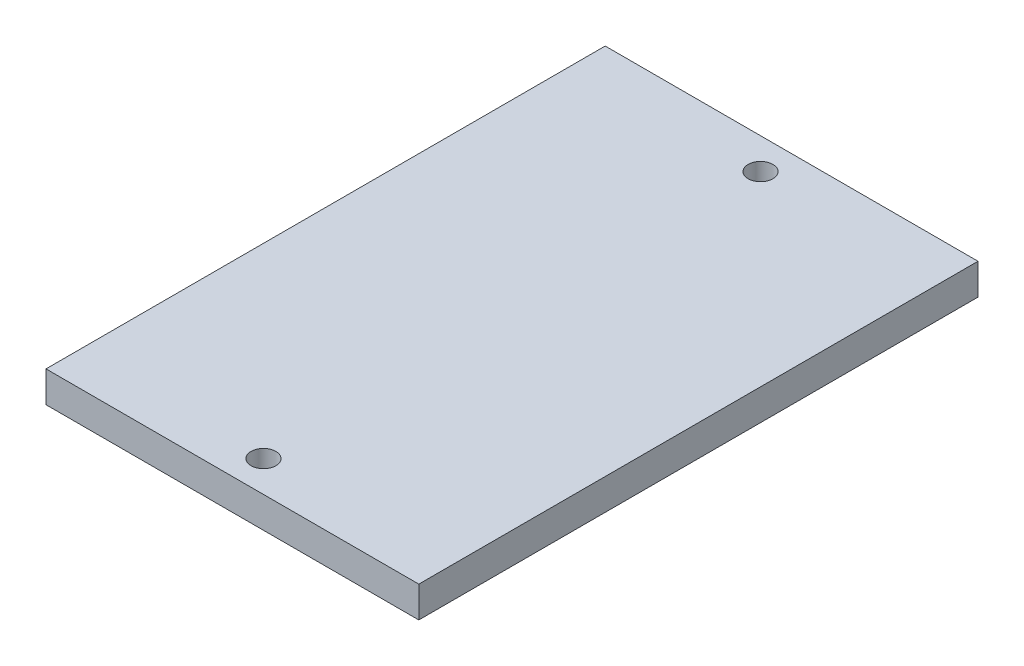
ISO-10303-21;
HEADER;
FILE_DESCRIPTION(('STEP AP214'),'2;1');
FILE_NAME('part.step','',(''),(''),'','','');
FILE_SCHEMA(('AUTOMOTIVE_DESIGN { 1 0 10303 214 1 1 1 1 }'));
ENDSEC;
DATA;
#1=APPLICATION_CONTEXT('core data for automotive mechanical design processes');
#2=APPLICATION_PROTOCOL_DEFINITION('international standard','automotive_design',2000,#1);
#3=PRODUCT_CONTEXT('',#1,'mechanical');
#4=PRODUCT('Part','Part','',(#3));
#5=PRODUCT_RELATED_PRODUCT_CATEGORY('part','',(#4));
#6=PRODUCT_DEFINITION_FORMATION('','',#4);
#7=PRODUCT_DEFINITION_CONTEXT('part definition',#1,'design');
#8=PRODUCT_DEFINITION('design','',#6,#7);
#9=PRODUCT_DEFINITION_SHAPE('','',#8);
#10=(LENGTH_UNIT() NAMED_UNIT(*) SI_UNIT(.MILLI.,.METRE.));
#11=(NAMED_UNIT(*) PLANE_ANGLE_UNIT() SI_UNIT($,.RADIAN.));
#12=(NAMED_UNIT(*) SI_UNIT($,.STERADIAN.) SOLID_ANGLE_UNIT());
#13=UNCERTAINTY_MEASURE_WITH_UNIT(LENGTH_MEASURE(1.E-05),#10,'distance_accuracy_value','');
#14=(GEOMETRIC_REPRESENTATION_CONTEXT(3) GLOBAL_UNCERTAINTY_ASSIGNED_CONTEXT((#13)) GLOBAL_UNIT_ASSIGNED_CONTEXT((#10,
#11,#12)) REPRESENTATION_CONTEXT('',''));
#15=CARTESIAN_POINT('',(0.,0.,0.));
#16=DIRECTION('',(0.,0.,1.));
#17=DIRECTION('',(1.,0.,0.));
#18=AXIS2_PLACEMENT_3D('',#15,#16,#17);
#19=CARTESIAN_POINT('',(36.2285196606894,6.35,57.15));
#20=DIRECTION('',(-1.,0.,0.));
#21=DIRECTION('',(0.,0.,1.));
#22=AXIS2_PLACEMENT_3D('',#19,#20,#21);
#23=PLANE('',#22);
#24=DIRECTION('',(0.,0.,-1.));
#25=VECTOR('',#24,1.);
#26=CARTESIAN_POINT('',(36.2285196606894,0.,57.15));
#27=LINE('',#26,#25);
#28=CARTESIAN_POINT('',(36.2285196606894,0.,57.15));
#29=VERTEX_POINT('',#28);
#30=CARTESIAN_POINT('',(36.2285196606894,0.,-57.15));
#31=VERTEX_POINT('',#30);
#32=EDGE_CURVE('E114',#29,#31,#27,.T.);
#33=ORIENTED_EDGE('',*,*,#32,.T.);
#34=DIRECTION('',(0.,-1.,0.));
#35=VECTOR('',#34,1.);
#36=CARTESIAN_POINT('',(36.2285196606894,6.35,-57.15));
#37=LINE('',#36,#35);
#38=CARTESIAN_POINT('',(36.2285196606894,6.35,-57.15));
#39=VERTEX_POINT('',#38);
#40=EDGE_CURVE('E11',#39,#31,#37,.T.);
#41=ORIENTED_EDGE('',*,*,#40,.F.);
#42=DIRECTION('',(0.,0.,-1.));
#43=VECTOR('',#42,1.);
#44=CARTESIAN_POINT('',(36.2285196606894,6.35,57.15));
#45=LINE('',#44,#43);
#46=CARTESIAN_POINT('',(36.2285196606894,6.35,57.15));
#47=VERTEX_POINT('',#46);
#48=EDGE_CURVE('E97',#47,#39,#45,.T.);
#49=ORIENTED_EDGE('',*,*,#48,.F.);
#50=DIRECTION('',(0.,-1.,0.));
#51=VECTOR('',#50,1.);
#52=CARTESIAN_POINT('',(36.2285196606894,6.35,57.15));
#53=LINE('',#52,#51);
#54=EDGE_CURVE('E110',#47,#29,#53,.T.);
#55=ORIENTED_EDGE('',*,*,#54,.T.);
#56=EDGE_LOOP('',(#33,#41,#49,#55));
#57=FACE_BOUND('',#56,.T.);
#58=ADVANCED_FACE('F43',(#57),#23,.F.);
#59=CARTESIAN_POINT('',(-39.9714803393106,6.35,-57.15));
#60=DIRECTION('',(0.,0.,1.));
#61=DIRECTION('',(1.,0.,0.));
#62=AXIS2_PLACEMENT_3D('',#59,#60,#61);
#63=PLANE('',#62);
#64=DIRECTION('',(-1.,0.,0.));
#65=VECTOR('',#64,1.);
#66=CARTESIAN_POINT('',(-39.9714803393106,0.,-57.15));
#67=LINE('',#66,#65);
#68=CARTESIAN_POINT('',(-39.9714803393106,0.,-57.15));
#69=VERTEX_POINT('',#68);
#70=EDGE_CURVE('E102',#31,#69,#67,.T.);
#71=ORIENTED_EDGE('',*,*,#70,.T.);
#72=DIRECTION('',(0.,-1.,0.));
#73=VECTOR('',#72,1.);
#74=CARTESIAN_POINT('',(-39.9714803393106,6.35,-57.15));
#75=LINE('',#74,#73);
#76=CARTESIAN_POINT('',(-39.9714803393106,6.35,-57.15));
#77=VERTEX_POINT('',#76);
#78=EDGE_CURVE('E53',#77,#69,#75,.T.);
#79=ORIENTED_EDGE('',*,*,#78,.F.);
#80=DIRECTION('',(-1.,0.,0.));
#81=VECTOR('',#80,1.);
#82=CARTESIAN_POINT('',(-39.9714803393106,6.35,-57.15));
#83=LINE('',#82,#81);
#84=EDGE_CURVE('E92',#39,#77,#83,.T.);
#85=ORIENTED_EDGE('',*,*,#84,.F.);
#86=ORIENTED_EDGE('',*,*,#40,.T.);
#87=EDGE_LOOP('',(#71,#79,#85,#86));
#88=FACE_BOUND('',#87,.T.);
#89=ADVANCED_FACE('F101',(#88),#63,.F.);
#90=CARTESIAN_POINT('',(-39.9714803393106,6.35,57.15));
#91=DIRECTION('',(1.,0.,0.));
#92=DIRECTION('',(0.,0.,-1.));
#93=AXIS2_PLACEMENT_3D('',#90,#91,#92);
#94=PLANE('',#93);
#95=DIRECTION('',(0.,0.,1.));
#96=VECTOR('',#95,1.);
#97=CARTESIAN_POINT('',(-39.9714803393106,0.,57.15));
#98=LINE('',#97,#96);
#99=CARTESIAN_POINT('',(-39.9714803393106,0.,57.15));
#100=VERTEX_POINT('',#99);
#101=EDGE_CURVE('E79',#69,#100,#98,.T.);
#102=ORIENTED_EDGE('',*,*,#101,.T.);
#103=DIRECTION('',(0.,-1.,0.));
#104=VECTOR('',#103,1.);
#105=CARTESIAN_POINT('',(-39.9714803393106,6.35,57.15));
#106=LINE('',#105,#104);
#107=CARTESIAN_POINT('',(-39.9714803393106,6.35,57.15));
#108=VERTEX_POINT('',#107);
#109=EDGE_CURVE('E104',#108,#100,#106,.T.);
#110=ORIENTED_EDGE('',*,*,#109,.F.);
#111=DIRECTION('',(0.,0.,1.));
#112=VECTOR('',#111,1.);
#113=CARTESIAN_POINT('',(-39.9714803393106,6.35,57.15));
#114=LINE('',#113,#112);
#115=EDGE_CURVE('E95',#77,#108,#114,.T.);
#116=ORIENTED_EDGE('',*,*,#115,.F.);
#117=ORIENTED_EDGE('',*,*,#78,.T.);
#118=EDGE_LOOP('',(#102,#110,#116,#117));
#119=FACE_BOUND('',#118,.T.);
#120=ADVANCED_FACE('F106',(#119),#94,.F.);
#121=CARTESIAN_POINT('',(-39.9714803393106,6.35,57.15));
#122=DIRECTION('',(0.,0.,-1.));
#123=DIRECTION('',(-1.,0.,0.));
#124=AXIS2_PLACEMENT_3D('',#121,#122,#123);
#125=PLANE('',#124);
#126=DIRECTION('',(1.,0.,0.));
#127=VECTOR('',#126,1.);
#128=CARTESIAN_POINT('',(-39.9714803393106,0.,57.15));
#129=LINE('',#128,#127);
#130=EDGE_CURVE('E85',#100,#29,#129,.T.);
#131=ORIENTED_EDGE('',*,*,#130,.T.);
#132=ORIENTED_EDGE('',*,*,#54,.F.);
#133=DIRECTION('',(1.,0.,0.));
#134=VECTOR('',#133,1.);
#135=CARTESIAN_POINT('',(-39.9714803393106,6.35,57.15));
#136=LINE('',#135,#134);
#137=EDGE_CURVE('E62',#108,#47,#136,.T.);
#138=ORIENTED_EDGE('',*,*,#137,.F.);
#139=ORIENTED_EDGE('',*,*,#109,.T.);
#140=EDGE_LOOP('',(#131,#132,#138,#139));
#141=FACE_BOUND('',#140,.T.);
#142=ADVANCED_FACE('F151',(#141),#125,.F.);
#143=CARTESIAN_POINT('',(0.,6.35,0.));
#144=DIRECTION('',(0.,-1.,0.));
#145=DIRECTION('',(0.,0.,-1.));
#146=AXIS2_PLACEMENT_3D('',#143,#144,#145);
#147=PLANE('',#146);
#148=CARTESIAN_POINT('',(-1.87148033931061,6.35,-50.8));
#149=DIRECTION('',(0.,1.,0.));
#150=DIRECTION('',(0.,0.,1.));
#151=AXIS2_PLACEMENT_3D('',#148,#149,#150);
#152=CIRCLE('',#151,2.53999999999999);
#153=CARTESIAN_POINT('',(-1.87148033931061,6.35,-48.26));
#154=VERTEX_POINT('',#153);
#155=EDGE_CURVE('E130',#154,#154,#152,.T.);
#156=ORIENTED_EDGE('',*,*,#155,.F.);
#157=EDGE_LOOP('',(#156));
#158=FACE_BOUND('',#157,.T.);
#159=CARTESIAN_POINT('',(-1.87148033931064,6.35,50.8));
#160=DIRECTION('',(0.,1.,0.));
#161=DIRECTION('',(0.,0.,-1.));
#162=AXIS2_PLACEMENT_3D('',#159,#160,#161);
#163=CIRCLE('',#162,2.53999999999999);
#164=CARTESIAN_POINT('',(-1.87148033931064,6.35,53.34));
#165=VERTEX_POINT('',#164);
#166=EDGE_CURVE('E137',#165,#165,#163,.T.);
#167=ORIENTED_EDGE('',*,*,#166,.F.);
#168=EDGE_LOOP('',(#167));
#169=FACE_BOUND('',#168,.T.);
#170=ORIENTED_EDGE('',*,*,#48,.T.);
#171=ORIENTED_EDGE('',*,*,#84,.T.);
#172=ORIENTED_EDGE('',*,*,#115,.T.);
#173=ORIENTED_EDGE('',*,*,#137,.T.);
#174=EDGE_LOOP('',(#170,#171,#172,#173));
#175=FACE_BOUND('',#174,.T.);
#176=ADVANCED_FACE('F93',(#158,#169,#175),#147,.F.);
#177=CARTESIAN_POINT('',(0.,0.,0.));
#178=DIRECTION('',(0.,-1.,0.));
#179=DIRECTION('',(0.,0.,-1.));
#180=AXIS2_PLACEMENT_3D('',#177,#178,#179);
#181=PLANE('',#180);
#182=CARTESIAN_POINT('',(-1.87148033931061,0.,-50.8));
#183=DIRECTION('',(0.,-1.,0.));
#184=DIRECTION('',(0.,0.,-1.));
#185=AXIS2_PLACEMENT_3D('',#182,#183,#184);
#186=CIRCLE('',#185,2.53999999999999);
#187=CARTESIAN_POINT('',(-1.87148033931061,0.,-48.26));
#188=VERTEX_POINT('',#187);
#189=EDGE_CURVE('E46',#188,#188,#186,.T.);
#190=ORIENTED_EDGE('',*,*,#189,.F.);
#191=EDGE_LOOP('',(#190));
#192=FACE_BOUND('',#191,.T.);
#193=CARTESIAN_POINT('',(-1.87148033931064,0.,50.8));
#194=DIRECTION('',(0.,-1.,0.));
#195=DIRECTION('',(0.,0.,-1.));
#196=AXIS2_PLACEMENT_3D('',#193,#194,#195);
#197=CIRCLE('',#196,2.53999999999999);
#198=CARTESIAN_POINT('',(-1.87148033931064,0.,53.34));
#199=VERTEX_POINT('',#198);
#200=EDGE_CURVE('E127',#199,#199,#197,.T.);
#201=ORIENTED_EDGE('',*,*,#200,.F.);
#202=EDGE_LOOP('',(#201));
#203=FACE_BOUND('',#202,.T.);
#204=ORIENTED_EDGE('',*,*,#32,.F.);
#205=ORIENTED_EDGE('',*,*,#130,.F.);
#206=ORIENTED_EDGE('',*,*,#101,.F.);
#207=ORIENTED_EDGE('',*,*,#70,.F.);
#208=EDGE_LOOP('',(#204,#205,#206,#207));
#209=FACE_BOUND('',#208,.T.);
#210=ADVANCED_FACE('F150',(#192,#203,#209),#181,.T.);
#211=CARTESIAN_POINT('',(-1.87148033931064,-3.175,50.8));
#212=DIRECTION('',(0.,1.,0.));
#213=DIRECTION('',(0.,0.,1.));
#214=AXIS2_PLACEMENT_3D('',#211,#212,#213);
#215=CYLINDRICAL_SURFACE('',#214,2.53999999999999);
#216=CARTESIAN_POINT('',(-1.87148033931064,0.,53.34));
#217=CARTESIAN_POINT('',(-1.87148033931064,0.0661458333333336,53.34));
#218=CARTESIAN_POINT('',(-1.87148033931064,0.132291666666667,53.34));
#219=CARTESIAN_POINT('',(-1.87148033931064,0.264583333333334,53.34));
#220=CARTESIAN_POINT('',(-1.87148033931064,0.330729166666667,53.34));
#221=CARTESIAN_POINT('',(-1.87148033931064,0.463020833333334,53.34));
#222=CARTESIAN_POINT('',(-1.87148033931064,0.529166666666667,53.34));
#223=CARTESIAN_POINT('',(-1.87148033931064,0.661458333333334,53.34));
#224=CARTESIAN_POINT('',(-1.87148033931064,0.727604166666667,53.34));
#225=CARTESIAN_POINT('',(-1.87148033931064,0.859895833333333,53.34));
#226=CARTESIAN_POINT('',(-1.87148033931064,0.926041666666667,53.34));
#227=CARTESIAN_POINT('',(-1.87148033931064,1.05833333333333,53.34));
#228=CARTESIAN_POINT('',(-1.87148033931064,1.12447916666667,53.34));
#229=CARTESIAN_POINT('',(-1.87148033931064,1.25677083333333,53.34));
#230=CARTESIAN_POINT('',(-1.87148033931064,1.32291666666667,53.34));
#231=CARTESIAN_POINT('',(-1.87148033931064,1.45520833333333,53.34));
#232=CARTESIAN_POINT('',(-1.87148033931064,1.52135416666667,53.34));
#233=CARTESIAN_POINT('',(-1.87148033931064,1.65364583333333,53.34));
#234=CARTESIAN_POINT('',(-1.87148033931064,1.71979166666667,53.34));
#235=CARTESIAN_POINT('',(-1.87148033931064,1.85208333333333,53.34));
#236=CARTESIAN_POINT('',(-1.87148033931064,1.91822916666667,53.34));
#237=CARTESIAN_POINT('',(-1.87148033931064,2.05052083333333,53.34));
#238=CARTESIAN_POINT('',(-1.87148033931064,2.11666666666667,53.34));
#239=CARTESIAN_POINT('',(-1.87148033931064,2.24895833333333,53.34));
#240=CARTESIAN_POINT('',(-1.87148033931064,2.31510416666667,53.34));
#241=CARTESIAN_POINT('',(-1.87148033931064,2.44739583333333,53.34));
#242=CARTESIAN_POINT('',(-1.87148033931064,2.51354166666667,53.34));
#243=CARTESIAN_POINT('',(-1.87148033931064,2.64583333333333,53.34));
#244=CARTESIAN_POINT('',(-1.87148033931064,2.71197916666667,53.34));
#245=CARTESIAN_POINT('',(-1.87148033931064,2.84427083333333,53.34));
#246=CARTESIAN_POINT('',(-1.87148033931064,2.91041666666667,53.34));
#247=CARTESIAN_POINT('',(-1.87148033931064,3.04270833333333,53.34));
#248=CARTESIAN_POINT('',(-1.87148033931064,3.10885416666667,53.34));
#249=CARTESIAN_POINT('',(-1.87148033931064,3.24114583333333,53.34));
#250=CARTESIAN_POINT('',(-1.87148033931064,3.30729166666667,53.34));
#251=CARTESIAN_POINT('',(-1.87148033931064,3.43958333333333,53.34));
#252=CARTESIAN_POINT('',(-1.87148033931064,3.50572916666667,53.34));
#253=CARTESIAN_POINT('',(-1.87148033931064,3.63802083333333,53.34));
#254=CARTESIAN_POINT('',(-1.87148033931064,3.70416666666667,53.34));
#255=CARTESIAN_POINT('',(-1.87148033931064,3.83645833333333,53.34));
#256=CARTESIAN_POINT('',(-1.87148033931064,3.90260416666667,53.34));
#257=CARTESIAN_POINT('',(-1.87148033931064,4.03489583333333,53.34));
#258=CARTESIAN_POINT('',(-1.87148033931064,4.10104166666667,53.34));
#259=CARTESIAN_POINT('',(-1.87148033931064,4.23333333333333,53.34));
#260=CARTESIAN_POINT('',(-1.87148033931064,4.29947916666667,53.34));
#261=CARTESIAN_POINT('',(-1.87148033931064,4.43177083333333,53.34));
#262=CARTESIAN_POINT('',(-1.87148033931064,4.49791666666667,53.34));
#263=CARTESIAN_POINT('',(-1.87148033931064,4.63020833333333,53.34));
#264=CARTESIAN_POINT('',(-1.87148033931064,4.69635416666667,53.34));
#265=CARTESIAN_POINT('',(-1.87148033931064,4.82864583333333,53.34));
#266=CARTESIAN_POINT('',(-1.87148033931064,4.89479166666667,53.34));
#267=CARTESIAN_POINT('',(-1.87148033931064,5.02708333333333,53.34));
#268=CARTESIAN_POINT('',(-1.87148033931064,5.09322916666667,53.34));
#269=CARTESIAN_POINT('',(-1.87148033931064,5.22552083333333,53.34));
#270=CARTESIAN_POINT('',(-1.87148033931064,5.29166666666667,53.34));
#271=CARTESIAN_POINT('',(-1.87148033931064,5.42395833333333,53.34));
#272=CARTESIAN_POINT('',(-1.87148033931064,5.49010416666667,53.34));
#273=CARTESIAN_POINT('',(-1.87148033931064,5.62239583333333,53.34));
#274=CARTESIAN_POINT('',(-1.87148033931064,5.68854166666667,53.34));
#275=CARTESIAN_POINT('',(-1.87148033931064,5.82083333333333,53.34));
#276=CARTESIAN_POINT('',(-1.87148033931064,5.88697916666667,53.34));
#277=CARTESIAN_POINT('',(-1.87148033931064,6.01927083333333,53.34));
#278=CARTESIAN_POINT('',(-1.87148033931064,6.08541666666667,53.34));
#279=CARTESIAN_POINT('',(-1.87148033931064,6.21770833333333,53.34));
#280=CARTESIAN_POINT('',(-1.87148033931064,6.28385416666667,53.34));
#281=CARTESIAN_POINT('',(-1.87148033931064,6.35,53.34));
#282=B_SPLINE_CURVE_WITH_KNOTS('',3,(#216,#217,#218,#219,#220,#221,#222,#223,#224,#225,#226,
#227,#228,#229,#230,#231,#232,#233,#234,#235,#236,#237,#238,#239,#240,#241,#242,#243,#244,#245,
#246,#247,#248,#249,#250,#251,#252,#253,#254,#255,#256,#257,#258,#259,#260,#261,#262,#263,#264,
#265,#266,#267,#268,#269,#270,#271,#272,#273,#274,#275,#276,#277,#278,#279,#280,#281),
.UNSPECIFIED.,.F.,.F.,(4,2,2,2,2,2,2,2,2,2,2,2,2,2,2,2,2,2,2,2,2,2,2,2,2,2,2,2,2,2,2,2,4),(0.,
0.1984375,0.396875,0.5953125,0.79375,0.9921875,1.190625,1.3890625,1.5875,1.7859375,1.984375,
2.1828125,2.38125,2.5796875,2.778125,2.9765625,3.175,3.3734375,3.571875,3.7703125,3.96875,
4.1671875,4.365625,4.5640625,4.7625,4.9609375,5.159375,5.3578125,5.55625,5.7546875,5.953125,
6.1515625,6.35),.UNSPECIFIED.);
#283=EDGE_CURVE('BSEAM147',#199,#165,#282,.T.);
#284=ORIENTED_EDGE('',*,*,#200,.T.);
#285=ORIENTED_EDGE('',*,*,#166,.T.);
#286=ORIENTED_EDGE('',*,*,#283,.T.);
#287=ORIENTED_EDGE('',*,*,#283,.F.);
#288=EDGE_LOOP('',(#284,#286,#285,#287));
#289=FACE_BOUND('',#288,.T.);
#290=ADVANCED_FACE('F147',(#289),#215,.F.);
#291=CARTESIAN_POINT('',(-1.87148033931061,-3.175,-50.8));
#292=DIRECTION('',(0.,1.,0.));
#293=DIRECTION('',(0.,0.,1.));
#294=AXIS2_PLACEMENT_3D('',#291,#292,#293);
#295=CYLINDRICAL_SURFACE('',#294,2.53999999999999);
#296=CARTESIAN_POINT('',(-1.87148033931061,0.,-48.26));
#297=CARTESIAN_POINT('',(-1.87148033931061,0.0661458333333336,-48.26));
#298=CARTESIAN_POINT('',(-1.87148033931061,0.132291666666667,-48.26));
#299=CARTESIAN_POINT('',(-1.87148033931061,0.264583333333334,-48.26));
#300=CARTESIAN_POINT('',(-1.87148033931061,0.330729166666667,-48.26));
#301=CARTESIAN_POINT('',(-1.87148033931061,0.463020833333334,-48.26));
#302=CARTESIAN_POINT('',(-1.87148033931061,0.529166666666667,-48.26));
#303=CARTESIAN_POINT('',(-1.87148033931061,0.661458333333334,-48.26));
#304=CARTESIAN_POINT('',(-1.87148033931061,0.727604166666667,-48.26));
#305=CARTESIAN_POINT('',(-1.87148033931061,0.859895833333333,-48.26));
#306=CARTESIAN_POINT('',(-1.87148033931061,0.926041666666667,-48.26));
#307=CARTESIAN_POINT('',(-1.87148033931061,1.05833333333333,-48.26));
#308=CARTESIAN_POINT('',(-1.87148033931061,1.12447916666667,-48.26));
#309=CARTESIAN_POINT('',(-1.87148033931061,1.25677083333333,-48.26));
#310=CARTESIAN_POINT('',(-1.87148033931061,1.32291666666667,-48.26));
#311=CARTESIAN_POINT('',(-1.87148033931061,1.45520833333333,-48.26));
#312=CARTESIAN_POINT('',(-1.87148033931061,1.52135416666667,-48.26));
#313=CARTESIAN_POINT('',(-1.87148033931061,1.65364583333333,-48.26));
#314=CARTESIAN_POINT('',(-1.87148033931061,1.71979166666667,-48.26));
#315=CARTESIAN_POINT('',(-1.87148033931061,1.85208333333333,-48.26));
#316=CARTESIAN_POINT('',(-1.87148033931061,1.91822916666667,-48.26));
#317=CARTESIAN_POINT('',(-1.87148033931061,2.05052083333333,-48.26));
#318=CARTESIAN_POINT('',(-1.87148033931061,2.11666666666667,-48.26));
#319=CARTESIAN_POINT('',(-1.87148033931061,2.24895833333333,-48.26));
#320=CARTESIAN_POINT('',(-1.87148033931061,2.31510416666667,-48.26));
#321=CARTESIAN_POINT('',(-1.87148033931061,2.44739583333333,-48.26));
#322=CARTESIAN_POINT('',(-1.87148033931061,2.51354166666667,-48.26));
#323=CARTESIAN_POINT('',(-1.87148033931061,2.64583333333333,-48.26));
#324=CARTESIAN_POINT('',(-1.87148033931061,2.71197916666667,-48.26));
#325=CARTESIAN_POINT('',(-1.87148033931061,2.84427083333333,-48.26));
#326=CARTESIAN_POINT('',(-1.87148033931061,2.91041666666667,-48.26));
#327=CARTESIAN_POINT('',(-1.87148033931061,3.04270833333333,-48.26));
#328=CARTESIAN_POINT('',(-1.87148033931061,3.10885416666667,-48.26));
#329=CARTESIAN_POINT('',(-1.87148033931061,3.24114583333333,-48.26));
#330=CARTESIAN_POINT('',(-1.87148033931061,3.30729166666667,-48.26));
#331=CARTESIAN_POINT('',(-1.87148033931061,3.43958333333333,-48.26));
#332=CARTESIAN_POINT('',(-1.87148033931061,3.50572916666667,-48.26));
#333=CARTESIAN_POINT('',(-1.87148033931061,3.63802083333333,-48.26));
#334=CARTESIAN_POINT('',(-1.87148033931061,3.70416666666667,-48.26));
#335=CARTESIAN_POINT('',(-1.87148033931061,3.83645833333333,-48.26));
#336=CARTESIAN_POINT('',(-1.87148033931061,3.90260416666667,-48.26));
#337=CARTESIAN_POINT('',(-1.87148033931061,4.03489583333333,-48.26));
#338=CARTESIAN_POINT('',(-1.87148033931061,4.10104166666667,-48.26));
#339=CARTESIAN_POINT('',(-1.87148033931061,4.23333333333333,-48.26));
#340=CARTESIAN_POINT('',(-1.87148033931061,4.29947916666667,-48.26));
#341=CARTESIAN_POINT('',(-1.87148033931061,4.43177083333333,-48.26));
#342=CARTESIAN_POINT('',(-1.87148033931061,4.49791666666667,-48.26));
#343=CARTESIAN_POINT('',(-1.87148033931061,4.63020833333333,-48.26));
#344=CARTESIAN_POINT('',(-1.87148033931061,4.69635416666667,-48.26));
#345=CARTESIAN_POINT('',(-1.87148033931061,4.82864583333333,-48.26));
#346=CARTESIAN_POINT('',(-1.87148033931061,4.89479166666667,-48.26));
#347=CARTESIAN_POINT('',(-1.87148033931061,5.02708333333333,-48.26));
#348=CARTESIAN_POINT('',(-1.87148033931061,5.09322916666667,-48.26));
#349=CARTESIAN_POINT('',(-1.87148033931061,5.22552083333333,-48.26));
#350=CARTESIAN_POINT('',(-1.87148033931061,5.29166666666667,-48.26));
#351=CARTESIAN_POINT('',(-1.87148033931061,5.42395833333333,-48.26));
#352=CARTESIAN_POINT('',(-1.87148033931061,5.49010416666667,-48.26));
#353=CARTESIAN_POINT('',(-1.87148033931061,5.62239583333333,-48.26));
#354=CARTESIAN_POINT('',(-1.87148033931061,5.68854166666667,-48.26));
#355=CARTESIAN_POINT('',(-1.87148033931061,5.82083333333333,-48.26));
#356=CARTESIAN_POINT('',(-1.87148033931061,5.88697916666667,-48.26));
#357=CARTESIAN_POINT('',(-1.87148033931061,6.01927083333333,-48.26));
#358=CARTESIAN_POINT('',(-1.87148033931061,6.08541666666667,-48.26));
#359=CARTESIAN_POINT('',(-1.87148033931061,6.21770833333333,-48.26));
#360=CARTESIAN_POINT('',(-1.87148033931061,6.28385416666667,-48.26));
#361=CARTESIAN_POINT('',(-1.87148033931061,6.35,-48.26));
#362=B_SPLINE_CURVE_WITH_KNOTS('',3,(#296,#297,#298,#299,#300,#301,#302,#303,#304,#305,#306,
#307,#308,#309,#310,#311,#312,#313,#314,#315,#316,#317,#318,#319,#320,#321,#322,#323,#324,#325,
#326,#327,#328,#329,#330,#331,#332,#333,#334,#335,#336,#337,#338,#339,#340,#341,#342,#343,#344,
#345,#346,#347,#348,#349,#350,#351,#352,#353,#354,#355,#356,#357,#358,#359,#360,#361),
.UNSPECIFIED.,.F.,.F.,(4,2,2,2,2,2,2,2,2,2,2,2,2,2,2,2,2,2,2,2,2,2,2,2,2,2,2,2,2,2,2,2,4),(0.,
0.1984375,0.396875,0.5953125,0.79375,0.9921875,1.190625,1.3890625,1.5875,1.7859375,1.984375,
2.1828125,2.38125,2.5796875,2.778125,2.9765625,3.175,3.3734375,3.571875,3.7703125,3.96875,
4.1671875,4.365625,4.5640625,4.7625,4.9609375,5.159375,5.3578125,5.55625,5.7546875,5.953125,
6.1515625,6.35),.UNSPECIFIED.);
#363=EDGE_CURVE('BSEAM201',#188,#154,#362,.T.);
#364=ORIENTED_EDGE('',*,*,#189,.T.);
#365=ORIENTED_EDGE('',*,*,#155,.T.);
#366=ORIENTED_EDGE('',*,*,#363,.T.);
#367=ORIENTED_EDGE('',*,*,#363,.F.);
#368=EDGE_LOOP('',(#364,#366,#365,#367));
#369=FACE_BOUND('',#368,.T.);
#370=ADVANCED_FACE('F201',(#369),#295,.F.);
#371=CLOSED_SHELL('',(#58,#89,#120,#142,#176,#210,#290,#370));
#372=MANIFOLD_SOLID_BREP('B2',#371);
#373=ADVANCED_BREP_SHAPE_REPRESENTATION('',(#18,#372),#14);
#374=SHAPE_DEFINITION_REPRESENTATION(#9,#373);
ENDSEC;
END-ISO-10303-21;
